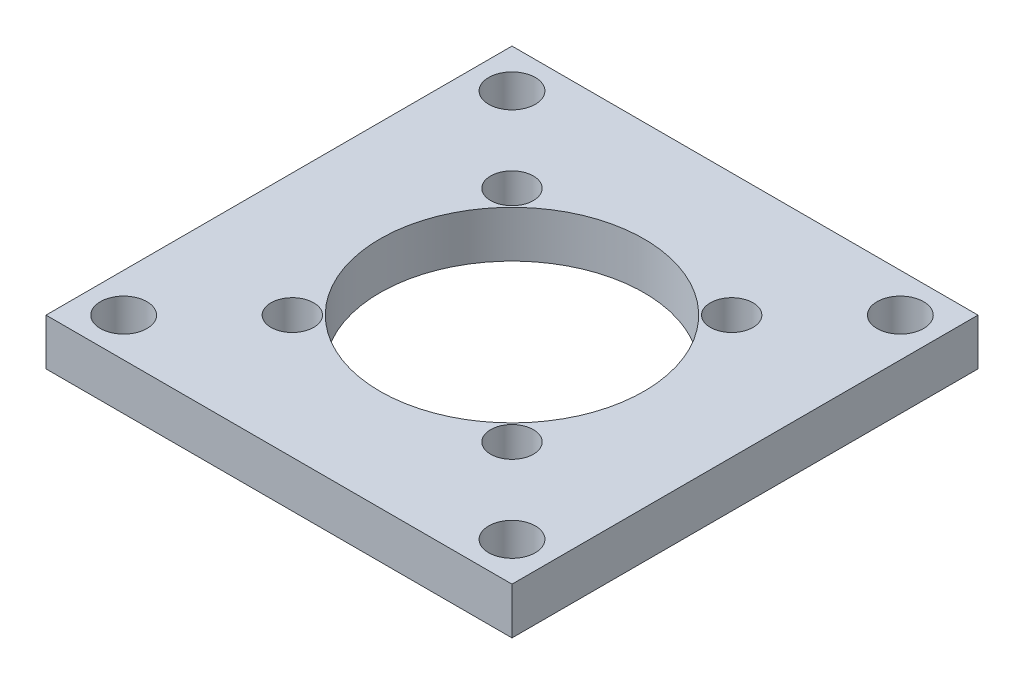
ISO-10303-21;
HEADER;
FILE_DESCRIPTION(('STEP AP214'),'2;1');
FILE_NAME('part.step','',(''),(''),'','','');
FILE_SCHEMA(('AUTOMOTIVE_DESIGN { 1 0 10303 214 1 1 1 1 }'));
ENDSEC;
DATA;
#1=APPLICATION_CONTEXT('core data for automotive mechanical design processes');
#2=APPLICATION_PROTOCOL_DEFINITION('international standard','automotive_design',2000,#1);
#3=PRODUCT_CONTEXT('',#1,'mechanical');
#4=PRODUCT('Part','Part','',(#3));
#5=PRODUCT_RELATED_PRODUCT_CATEGORY('part','',(#4));
#6=PRODUCT_DEFINITION_FORMATION('','',#4);
#7=PRODUCT_DEFINITION_CONTEXT('part definition',#1,'design');
#8=PRODUCT_DEFINITION('design','',#6,#7);
#9=PRODUCT_DEFINITION_SHAPE('','',#8);
#10=(LENGTH_UNIT() NAMED_UNIT(*) SI_UNIT(.MILLI.,.METRE.));
#11=(NAMED_UNIT(*) PLANE_ANGLE_UNIT() SI_UNIT($,.RADIAN.));
#12=(NAMED_UNIT(*) SI_UNIT($,.STERADIAN.) SOLID_ANGLE_UNIT());
#13=UNCERTAINTY_MEASURE_WITH_UNIT(LENGTH_MEASURE(1.E-05),#10,'distance_accuracy_value','');
#14=(GEOMETRIC_REPRESENTATION_CONTEXT(3) GLOBAL_UNCERTAINTY_ASSIGNED_CONTEXT((#13)) GLOBAL_UNIT_ASSIGNED_CONTEXT((#10,
#11,#12)) REPRESENTATION_CONTEXT('',''));
#15=CARTESIAN_POINT('',(0.,0.,0.));
#16=DIRECTION('',(0.,0.,1.));
#17=DIRECTION('',(1.,0.,0.));
#18=AXIS2_PLACEMENT_3D('',#15,#16,#17);
#19=CARTESIAN_POINT('',(0.,6.,-60.));
#20=DIRECTION('',(0.,0.,-1.));
#21=DIRECTION('',(-1.,0.,0.));
#22=AXIS2_PLACEMENT_3D('',#19,#20,#21);
#23=PLANE('',#22);
#24=DIRECTION('',(1.,0.,0.));
#25=VECTOR('',#24,1.);
#26=CARTESIAN_POINT('',(0.,0.,-60.));
#27=LINE('',#26,#25);
#28=CARTESIAN_POINT('',(0.,0.,-60.));
#29=VERTEX_POINT('',#28);
#30=CARTESIAN_POINT('',(60.,0.,-60.));
#31=VERTEX_POINT('',#30);
#32=EDGE_CURVE('E139',#29,#31,#27,.T.);
#33=ORIENTED_EDGE('',*,*,#32,.F.);
#34=DIRECTION('',(0.,-1.,0.));
#35=VECTOR('',#34,1.);
#36=CARTESIAN_POINT('',(0.,6.,-60.));
#37=LINE('',#36,#35);
#38=CARTESIAN_POINT('',(0.,6.,-60.));
#39=VERTEX_POINT('',#38);
#40=EDGE_CURVE('E11',#39,#29,#37,.T.);
#41=ORIENTED_EDGE('',*,*,#40,.F.);
#42=DIRECTION('',(1.,0.,0.));
#43=VECTOR('',#42,1.);
#44=CARTESIAN_POINT('',(0.,6.,-60.));
#45=LINE('',#44,#43);
#46=CARTESIAN_POINT('',(60.,6.,-60.));
#47=VERTEX_POINT('',#46);
#48=EDGE_CURVE('E109',#39,#47,#45,.T.);
#49=ORIENTED_EDGE('',*,*,#48,.T.);
#50=DIRECTION('',(0.,-1.,0.));
#51=VECTOR('',#50,1.);
#52=CARTESIAN_POINT('',(60.,6.,-60.));
#53=LINE('',#52,#51);
#54=EDGE_CURVE('E84',#47,#31,#53,.T.);
#55=ORIENTED_EDGE('',*,*,#54,.T.);
#56=EDGE_LOOP('',(#33,#41,#49,#55));
#57=FACE_BOUND('',#56,.T.);
#58=ADVANCED_FACE('F41',(#57),#23,.T.);
#59=CARTESIAN_POINT('',(0.,6.,0.));
#60=DIRECTION('',(-1.,0.,0.));
#61=DIRECTION('',(0.,0.,1.));
#62=AXIS2_PLACEMENT_3D('',#59,#60,#61);
#63=PLANE('',#62);
#64=DIRECTION('',(0.,0.,-1.));
#65=VECTOR('',#64,1.);
#66=CARTESIAN_POINT('',(0.,0.,0.));
#67=LINE('',#66,#65);
#68=CARTESIAN_POINT('',(0.,0.,0.));
#69=VERTEX_POINT('',#68);
#70=EDGE_CURVE('E96',#69,#29,#67,.T.);
#71=ORIENTED_EDGE('',*,*,#70,.F.);
#72=DIRECTION('',(0.,-1.,0.));
#73=VECTOR('',#72,1.);
#74=CARTESIAN_POINT('',(0.,6.,0.));
#75=LINE('',#74,#73);
#76=CARTESIAN_POINT('',(0.,6.,0.));
#77=VERTEX_POINT('',#76);
#78=EDGE_CURVE('E52',#77,#69,#75,.T.);
#79=ORIENTED_EDGE('',*,*,#78,.F.);
#80=DIRECTION('',(0.,0.,-1.));
#81=VECTOR('',#80,1.);
#82=CARTESIAN_POINT('',(0.,6.,0.));
#83=LINE('',#82,#81);
#84=EDGE_CURVE('E94',#77,#39,#83,.T.);
#85=ORIENTED_EDGE('',*,*,#84,.T.);
#86=ORIENTED_EDGE('',*,*,#40,.T.);
#87=EDGE_LOOP('',(#71,#79,#85,#86));
#88=FACE_BOUND('',#87,.T.);
#89=ADVANCED_FACE('F92',(#88),#63,.T.);
#90=CARTESIAN_POINT('',(0.,6.,0.));
#91=DIRECTION('',(0.,0.,-1.));
#92=DIRECTION('',(-1.,0.,0.));
#93=AXIS2_PLACEMENT_3D('',#90,#91,#92);
#94=PLANE('',#93);
#95=DIRECTION('',(1.,0.,0.));
#96=VECTOR('',#95,1.);
#97=CARTESIAN_POINT('',(0.,0.,0.));
#98=LINE('',#97,#96);
#99=CARTESIAN_POINT('',(60.,0.,0.));
#100=VERTEX_POINT('',#99);
#101=EDGE_CURVE('E144',#69,#100,#98,.T.);
#102=ORIENTED_EDGE('',*,*,#101,.T.);
#103=DIRECTION('',(0.,-1.,0.));
#104=VECTOR('',#103,1.);
#105=CARTESIAN_POINT('',(60.,6.,0.));
#106=LINE('',#105,#104);
#107=CARTESIAN_POINT('',(60.,6.,0.));
#108=VERTEX_POINT('',#107);
#109=EDGE_CURVE('E100',#108,#100,#106,.T.);
#110=ORIENTED_EDGE('',*,*,#109,.F.);
#111=DIRECTION('',(1.,0.,0.));
#112=VECTOR('',#111,1.);
#113=CARTESIAN_POINT('',(0.,6.,0.));
#114=LINE('',#113,#112);
#115=EDGE_CURVE('E103',#77,#108,#114,.T.);
#116=ORIENTED_EDGE('',*,*,#115,.F.);
#117=ORIENTED_EDGE('',*,*,#78,.T.);
#118=EDGE_LOOP('',(#102,#110,#116,#117));
#119=FACE_BOUND('',#118,.T.);
#120=ADVANCED_FACE('F104',(#119),#94,.F.);
#121=CARTESIAN_POINT('',(60.,6.,0.));
#122=DIRECTION('',(-1.,0.,0.));
#123=DIRECTION('',(0.,0.,1.));
#124=AXIS2_PLACEMENT_3D('',#121,#122,#123);
#125=PLANE('',#124);
#126=DIRECTION('',(0.,0.,-1.));
#127=VECTOR('',#126,1.);
#128=CARTESIAN_POINT('',(60.,0.,0.));
#129=LINE('',#128,#127);
#130=EDGE_CURVE('E77',#100,#31,#129,.T.);
#131=ORIENTED_EDGE('',*,*,#130,.T.);
#132=ORIENTED_EDGE('',*,*,#54,.F.);
#133=DIRECTION('',(0.,0.,-1.));
#134=VECTOR('',#133,1.);
#135=CARTESIAN_POINT('',(60.,6.,0.));
#136=LINE('',#135,#134);
#137=EDGE_CURVE('E61',#108,#47,#136,.T.);
#138=ORIENTED_EDGE('',*,*,#137,.F.);
#139=ORIENTED_EDGE('',*,*,#109,.T.);
#140=EDGE_LOOP('',(#131,#132,#138,#139));
#141=FACE_BOUND('',#140,.T.);
#142=ADVANCED_FACE('F202',(#141),#125,.F.);
#143=CARTESIAN_POINT('',(44.142135623731,6.,-15.857864376269));
#144=DIRECTION('',(0.,-1.,0.));
#145=DIRECTION('',(0.,0.,-1.));
#146=AXIS2_PLACEMENT_3D('',#143,#144,#145);
#147=CYLINDRICAL_SURFACE('',#146,2.75);
#148=CARTESIAN_POINT('',(44.142135623731,6.,-15.857864376269));
#149=DIRECTION('',(0.,1.,0.));
#150=DIRECTION('',(0.,0.,1.));
#151=AXIS2_PLACEMENT_3D('',#148,#149,#150);
#152=CIRCLE('',#151,2.75);
#153=CARTESIAN_POINT('',(44.142135623731,6.,-13.107864376269));
#154=VERTEX_POINT('',#153);
#155=EDGE_CURVE('E113',#154,#154,#152,.T.);
#156=ORIENTED_EDGE('',*,*,#155,.T.);
#157=EDGE_LOOP('',(#156));
#158=FACE_BOUND('',#157,.T.);
#159=CARTESIAN_POINT('',(44.142135623731,0.,-15.857864376269));
#160=DIRECTION('',(0.,1.,0.));
#161=DIRECTION('',(0.,0.,1.));
#162=AXIS2_PLACEMENT_3D('',#159,#160,#161);
#163=CIRCLE('',#162,2.75);
#164=CARTESIAN_POINT('',(44.142135623731,0.,-13.107864376269));
#165=VERTEX_POINT('',#164);
#166=EDGE_CURVE('E135',#165,#165,#163,.T.);
#167=ORIENTED_EDGE('',*,*,#166,.F.);
#168=EDGE_LOOP('',(#167));
#169=FACE_BOUND('',#168,.T.);
#170=ADVANCED_FACE('F198',(#158,#169),#147,.F.);
#171=CARTESIAN_POINT('',(30.,6.,-30.));
#172=DIRECTION('',(0.,-1.,0.));
#173=DIRECTION('',(0.,0.,-1.));
#174=AXIS2_PLACEMENT_3D('',#171,#172,#173);
#175=CYLINDRICAL_SURFACE('',#174,17.);
#176=CARTESIAN_POINT('',(30.,6.,-30.));
#177=DIRECTION('',(0.,1.,0.));
#178=DIRECTION('',(0.,0.,1.));
#179=AXIS2_PLACEMENT_3D('',#176,#177,#178);
#180=CIRCLE('',#179,17.);
#181=CARTESIAN_POINT('',(30.,6.,-13.));
#182=VERTEX_POINT('',#181);
#183=EDGE_CURVE('E350',#182,#182,#180,.T.);
#184=ORIENTED_EDGE('',*,*,#183,.T.);
#185=EDGE_LOOP('',(#184));
#186=FACE_BOUND('',#185,.T.);
#187=CARTESIAN_POINT('',(30.,0.,-30.));
#188=DIRECTION('',(0.,1.,0.));
#189=DIRECTION('',(0.,0.,1.));
#190=AXIS2_PLACEMENT_3D('',#187,#188,#189);
#191=CIRCLE('',#190,17.);
#192=CARTESIAN_POINT('',(30.,0.,-13.));
#193=VERTEX_POINT('',#192);
#194=EDGE_CURVE('E131',#193,#193,#191,.T.);
#195=ORIENTED_EDGE('',*,*,#194,.F.);
#196=EDGE_LOOP('',(#195));
#197=FACE_BOUND('',#196,.T.);
#198=ADVANCED_FACE('F201',(#186,#197),#175,.F.);
#199=CARTESIAN_POINT('',(44.142135623731,6.,-44.1421356237309));
#200=DIRECTION('',(0.,-1.,0.));
#201=DIRECTION('',(0.,0.,-1.));
#202=AXIS2_PLACEMENT_3D('',#199,#200,#201);
#203=CYLINDRICAL_SURFACE('',#202,2.75);
#204=CARTESIAN_POINT('',(44.142135623731,6.,-44.1421356237309));
#205=DIRECTION('',(0.,1.,0.));
#206=DIRECTION('',(0.,0.,1.));
#207=AXIS2_PLACEMENT_3D('',#204,#205,#206);
#208=CIRCLE('',#207,2.75);
#209=CARTESIAN_POINT('',(44.142135623731,6.,-41.3921356237309));
#210=VERTEX_POINT('',#209);
#211=EDGE_CURVE('E217',#210,#210,#208,.T.);
#212=ORIENTED_EDGE('',*,*,#211,.T.);
#213=EDGE_LOOP('',(#212));
#214=FACE_BOUND('',#213,.T.);
#215=CARTESIAN_POINT('',(44.142135623731,0.,-44.1421356237309));
#216=DIRECTION('',(0.,1.,0.));
#217=DIRECTION('',(0.,0.,1.));
#218=AXIS2_PLACEMENT_3D('',#215,#216,#217);
#219=CIRCLE('',#218,2.75);
#220=CARTESIAN_POINT('',(44.142135623731,0.,-41.3921356237309));
#221=VERTEX_POINT('',#220);
#222=EDGE_CURVE('E127',#221,#221,#219,.T.);
#223=ORIENTED_EDGE('',*,*,#222,.F.);
#224=EDGE_LOOP('',(#223));
#225=FACE_BOUND('',#224,.T.);
#226=ADVANCED_FACE('F205',(#214,#225),#203,.F.);
#227=CARTESIAN_POINT('',(15.8578643762691,6.,-44.1421356237309));
#228=DIRECTION('',(0.,-1.,0.));
#229=DIRECTION('',(0.,0.,-1.));
#230=AXIS2_PLACEMENT_3D('',#227,#228,#229);
#231=CYLINDRICAL_SURFACE('',#230,2.75);
#232=CARTESIAN_POINT('',(15.8578643762691,6.,-44.1421356237309));
#233=DIRECTION('',(0.,1.,0.));
#234=DIRECTION('',(0.,0.,1.));
#235=AXIS2_PLACEMENT_3D('',#232,#233,#234);
#236=CIRCLE('',#235,2.75);
#237=CARTESIAN_POINT('',(15.8578643762691,6.,-41.3921356237309));
#238=VERTEX_POINT('',#237);
#239=EDGE_CURVE('E153',#238,#238,#236,.T.);
#240=ORIENTED_EDGE('',*,*,#239,.T.);
#241=EDGE_LOOP('',(#240));
#242=FACE_BOUND('',#241,.T.);
#243=CARTESIAN_POINT('',(15.8578643762691,0.,-44.1421356237309));
#244=DIRECTION('',(0.,1.,0.));
#245=DIRECTION('',(0.,0.,1.));
#246=AXIS2_PLACEMENT_3D('',#243,#244,#245);
#247=CIRCLE('',#246,2.75);
#248=CARTESIAN_POINT('',(15.8578643762691,0.,-41.3921356237309));
#249=VERTEX_POINT('',#248);
#250=EDGE_CURVE('E123',#249,#249,#247,.T.);
#251=ORIENTED_EDGE('',*,*,#250,.F.);
#252=EDGE_LOOP('',(#251));
#253=FACE_BOUND('',#252,.T.);
#254=ADVANCED_FACE('F43',(#242,#253),#231,.F.);
#255=CARTESIAN_POINT('',(15.8578643762691,6.,-15.857864376269));
#256=DIRECTION('',(0.,-1.,0.));
#257=DIRECTION('',(0.,0.,-1.));
#258=AXIS2_PLACEMENT_3D('',#255,#256,#257);
#259=CYLINDRICAL_SURFACE('',#258,2.75);
#260=CARTESIAN_POINT('',(15.8578643762691,6.,-15.857864376269));
#261=DIRECTION('',(0.,1.,0.));
#262=DIRECTION('',(0.,0.,1.));
#263=AXIS2_PLACEMENT_3D('',#260,#261,#262);
#264=CIRCLE('',#263,2.75);
#265=CARTESIAN_POINT('',(15.8578643762691,6.,-13.107864376269));
#266=VERTEX_POINT('',#265);
#267=EDGE_CURVE('E119',#266,#266,#264,.T.);
#268=ORIENTED_EDGE('',*,*,#267,.T.);
#269=EDGE_LOOP('',(#268));
#270=FACE_BOUND('',#269,.T.);
#271=CARTESIAN_POINT('',(15.8578643762691,0.,-15.857864376269));
#272=DIRECTION('',(0.,1.,0.));
#273=DIRECTION('',(0.,0.,1.));
#274=AXIS2_PLACEMENT_3D('',#271,#272,#273);
#275=CIRCLE('',#274,2.75);
#276=CARTESIAN_POINT('',(15.8578643762691,0.,-13.107864376269));
#277=VERTEX_POINT('',#276);
#278=EDGE_CURVE('E149',#277,#277,#275,.T.);
#279=ORIENTED_EDGE('',*,*,#278,.F.);
#280=EDGE_LOOP('',(#279));
#281=FACE_BOUND('',#280,.T.);
#282=ADVANCED_FACE('F212',(#270,#281),#259,.F.);
#283=CARTESIAN_POINT('',(0.,6.,0.));
#284=DIRECTION('',(0.,1.,0.));
#285=DIRECTION('',(0.,0.,1.));
#286=AXIS2_PLACEMENT_3D('',#283,#284,#285);
#287=PLANE('',#286);
#288=CARTESIAN_POINT('',(5.00000000000001,6.,-55.));
#289=DIRECTION('',(0.,1.,0.));
#290=DIRECTION('',(0.,0.,1.));
#291=AXIS2_PLACEMENT_3D('',#288,#289,#290);
#292=CIRCLE('',#291,3.);
#293=CARTESIAN_POINT('',(5.00000000000001,6.,-52.));
#294=VERTEX_POINT('',#293);
#295=EDGE_CURVE('E340',#294,#294,#292,.T.);
#296=ORIENTED_EDGE('',*,*,#295,.F.);
#297=EDGE_LOOP('',(#296));
#298=FACE_BOUND('',#297,.T.);
#299=CARTESIAN_POINT('',(5.00000000000001,6.,-5.));
#300=DIRECTION('',(0.,1.,0.));
#301=DIRECTION('',(0.,0.,1.));
#302=AXIS2_PLACEMENT_3D('',#299,#300,#301);
#303=CIRCLE('',#302,3.);
#304=CARTESIAN_POINT('',(5.00000000000001,6.,-2.));
#305=VERTEX_POINT('',#304);
#306=EDGE_CURVE('E333',#305,#305,#303,.T.);
#307=ORIENTED_EDGE('',*,*,#306,.F.);
#308=EDGE_LOOP('',(#307));
#309=FACE_BOUND('',#308,.T.);
#310=CARTESIAN_POINT('',(55.,6.,-5.));
#311=DIRECTION('',(0.,1.,0.));
#312=DIRECTION('',(0.,0.,1.));
#313=AXIS2_PLACEMENT_3D('',#310,#311,#312);
#314=CIRCLE('',#313,3.00000000000001);
#315=CARTESIAN_POINT('',(55.,6.,-2.));
#316=VERTEX_POINT('',#315);
#317=EDGE_CURVE('E322',#316,#316,#314,.T.);
#318=ORIENTED_EDGE('',*,*,#317,.F.);
#319=EDGE_LOOP('',(#318));
#320=FACE_BOUND('',#319,.T.);
#321=CARTESIAN_POINT('',(55.,6.,-55.));
#322=DIRECTION('',(0.,1.,0.));
#323=DIRECTION('',(0.,0.,1.));
#324=AXIS2_PLACEMENT_3D('',#321,#322,#323);
#325=CIRCLE('',#324,3.00000000000001);
#326=CARTESIAN_POINT('',(55.,6.,-52.));
#327=VERTEX_POINT('',#326);
#328=EDGE_CURVE('E163',#327,#327,#325,.T.);
#329=ORIENTED_EDGE('',*,*,#328,.F.);
#330=EDGE_LOOP('',(#329));
#331=FACE_BOUND('',#330,.T.);
#332=ORIENTED_EDGE('',*,*,#239,.F.);
#333=EDGE_LOOP('',(#332));
#334=FACE_BOUND('',#333,.T.);
#335=ORIENTED_EDGE('',*,*,#211,.F.);
#336=EDGE_LOOP('',(#335));
#337=FACE_BOUND('',#336,.T.);
#338=ORIENTED_EDGE('',*,*,#183,.F.);
#339=EDGE_LOOP('',(#338));
#340=FACE_BOUND('',#339,.T.);
#341=ORIENTED_EDGE('',*,*,#155,.F.);
#342=EDGE_LOOP('',(#341));
#343=FACE_BOUND('',#342,.T.);
#344=ORIENTED_EDGE('',*,*,#48,.F.);
#345=ORIENTED_EDGE('',*,*,#84,.F.);
#346=ORIENTED_EDGE('',*,*,#115,.T.);
#347=ORIENTED_EDGE('',*,*,#137,.T.);
#348=EDGE_LOOP('',(#344,#345,#346,#347));
#349=FACE_BOUND('',#348,.T.);
#350=ORIENTED_EDGE('',*,*,#267,.F.);
#351=EDGE_LOOP('',(#350));
#352=FACE_BOUND('',#351,.T.);
#353=ADVANCED_FACE('F107',(#298,#309,#320,#331,#334,#337,#340,#343,#349,#352),#287,.T.);
#354=CARTESIAN_POINT('',(0.,0.,0.));
#355=DIRECTION('',(0.,1.,0.));
#356=DIRECTION('',(0.,0.,1.));
#357=AXIS2_PLACEMENT_3D('',#354,#355,#356);
#358=PLANE('',#357);
#359=CARTESIAN_POINT('',(5.00000000000001,0.,-55.));
#360=DIRECTION('',(0.,1.,0.));
#361=DIRECTION('',(0.,0.,1.));
#362=AXIS2_PLACEMENT_3D('',#359,#360,#361);
#363=CIRCLE('',#362,3.);
#364=CARTESIAN_POINT('',(5.00000000000001,0.,-52.));
#365=VERTEX_POINT('',#364);
#366=EDGE_CURVE('E45',#365,#365,#363,.T.);
#367=ORIENTED_EDGE('',*,*,#366,.T.);
#368=EDGE_LOOP('',(#367));
#369=FACE_BOUND('',#368,.T.);
#370=CARTESIAN_POINT('',(5.00000000000001,0.,-5.));
#371=DIRECTION('',(0.,1.,0.));
#372=DIRECTION('',(0.,0.,1.));
#373=AXIS2_PLACEMENT_3D('',#370,#371,#372);
#374=CIRCLE('',#373,3.);
#375=CARTESIAN_POINT('',(5.00000000000001,0.,-2.));
#376=VERTEX_POINT('',#375);
#377=EDGE_CURVE('E166',#376,#376,#374,.T.);
#378=ORIENTED_EDGE('',*,*,#377,.T.);
#379=EDGE_LOOP('',(#378));
#380=FACE_BOUND('',#379,.T.);
#381=CARTESIAN_POINT('',(55.,0.,-5.));
#382=DIRECTION('',(0.,1.,0.));
#383=DIRECTION('',(0.,0.,1.));
#384=AXIS2_PLACEMENT_3D('',#381,#382,#383);
#385=CIRCLE('',#384,3.00000000000001);
#386=CARTESIAN_POINT('',(55.,0.,-2.));
#387=VERTEX_POINT('',#386);
#388=EDGE_CURVE('E162',#387,#387,#385,.T.);
#389=ORIENTED_EDGE('',*,*,#388,.T.);
#390=EDGE_LOOP('',(#389));
#391=FACE_BOUND('',#390,.T.);
#392=CARTESIAN_POINT('',(55.,0.,-55.));
#393=DIRECTION('',(0.,1.,0.));
#394=DIRECTION('',(0.,0.,1.));
#395=AXIS2_PLACEMENT_3D('',#392,#393,#394);
#396=CIRCLE('',#395,3.00000000000001);
#397=CARTESIAN_POINT('',(55.,0.,-52.));
#398=VERTEX_POINT('',#397);
#399=EDGE_CURVE('E158',#398,#398,#396,.T.);
#400=ORIENTED_EDGE('',*,*,#399,.T.);
#401=EDGE_LOOP('',(#400));
#402=FACE_BOUND('',#401,.T.);
#403=ORIENTED_EDGE('',*,*,#250,.T.);
#404=EDGE_LOOP('',(#403));
#405=FACE_BOUND('',#404,.T.);
#406=ORIENTED_EDGE('',*,*,#222,.T.);
#407=EDGE_LOOP('',(#406));
#408=FACE_BOUND('',#407,.T.);
#409=ORIENTED_EDGE('',*,*,#194,.T.);
#410=EDGE_LOOP('',(#409));
#411=FACE_BOUND('',#410,.T.);
#412=ORIENTED_EDGE('',*,*,#166,.T.);
#413=EDGE_LOOP('',(#412));
#414=FACE_BOUND('',#413,.T.);
#415=ORIENTED_EDGE('',*,*,#32,.T.);
#416=ORIENTED_EDGE('',*,*,#130,.F.);
#417=ORIENTED_EDGE('',*,*,#101,.F.);
#418=ORIENTED_EDGE('',*,*,#70,.T.);
#419=EDGE_LOOP('',(#415,#416,#417,#418));
#420=FACE_BOUND('',#419,.T.);
#421=ORIENTED_EDGE('',*,*,#278,.T.);
#422=EDGE_LOOP('',(#421));
#423=FACE_BOUND('',#422,.T.);
#424=ADVANCED_FACE('F175',(#369,#380,#391,#402,#405,#408,#411,#414,#420,#423),#358,.F.);
#425=CARTESIAN_POINT('',(55.,-4.,-55.));
#426=DIRECTION('',(0.,1.,0.));
#427=DIRECTION('',(0.,0.,1.));
#428=AXIS2_PLACEMENT_3D('',#425,#426,#427);
#429=CYLINDRICAL_SURFACE('',#428,3.00000000000001);
#430=ORIENTED_EDGE('',*,*,#328,.T.);
#431=EDGE_LOOP('',(#430));
#432=FACE_BOUND('',#431,.T.);
#433=ORIENTED_EDGE('',*,*,#399,.F.);
#434=EDGE_LOOP('',(#433));
#435=FACE_BOUND('',#434,.T.);
#436=ADVANCED_FACE('F222',(#432,#435),#429,.F.);
#437=CARTESIAN_POINT('',(55.,-4.,-5.));
#438=DIRECTION('',(0.,1.,0.));
#439=DIRECTION('',(0.,0.,1.));
#440=AXIS2_PLACEMENT_3D('',#437,#438,#439);
#441=CYLINDRICAL_SURFACE('',#440,3.00000000000001);
#442=ORIENTED_EDGE('',*,*,#317,.T.);
#443=EDGE_LOOP('',(#442));
#444=FACE_BOUND('',#443,.T.);
#445=ORIENTED_EDGE('',*,*,#388,.F.);
#446=EDGE_LOOP('',(#445));
#447=FACE_BOUND('',#446,.T.);
#448=ADVANCED_FACE('F185',(#444,#447),#441,.F.);
#449=CARTESIAN_POINT('',(5.00000000000001,-4.,-5.));
#450=DIRECTION('',(0.,1.,0.));
#451=DIRECTION('',(0.,0.,1.));
#452=AXIS2_PLACEMENT_3D('',#449,#450,#451);
#453=CYLINDRICAL_SURFACE('',#452,3.);
#454=ORIENTED_EDGE('',*,*,#306,.T.);
#455=EDGE_LOOP('',(#454));
#456=FACE_BOUND('',#455,.T.);
#457=ORIENTED_EDGE('',*,*,#377,.F.);
#458=EDGE_LOOP('',(#457));
#459=FACE_BOUND('',#458,.T.);
#460=ADVANCED_FACE('F179',(#456,#459),#453,.F.);
#461=CARTESIAN_POINT('',(5.00000000000001,-4.,-55.));
#462=DIRECTION('',(0.,1.,0.));
#463=DIRECTION('',(0.,0.,1.));
#464=AXIS2_PLACEMENT_3D('',#461,#462,#463);
#465=CYLINDRICAL_SURFACE('',#464,3.);
#466=ORIENTED_EDGE('',*,*,#295,.T.);
#467=EDGE_LOOP('',(#466));
#468=FACE_BOUND('',#467,.T.);
#469=ORIENTED_EDGE('',*,*,#366,.F.);
#470=EDGE_LOOP('',(#469));
#471=FACE_BOUND('',#470,.T.);
#472=ADVANCED_FACE('F177',(#468,#471),#465,.F.);
#473=CLOSED_SHELL('',(#58,#89,#120,#142,#170,#198,#226,#254,#282,#353,#424,#436,#448,#460,#472));
#474=MANIFOLD_SOLID_BREP('B2',#473);
#475=ADVANCED_BREP_SHAPE_REPRESENTATION('',(#18,#474),#14);
#476=SHAPE_DEFINITION_REPRESENTATION(#9,#475);
ENDSEC;
END-ISO-10303-21;
